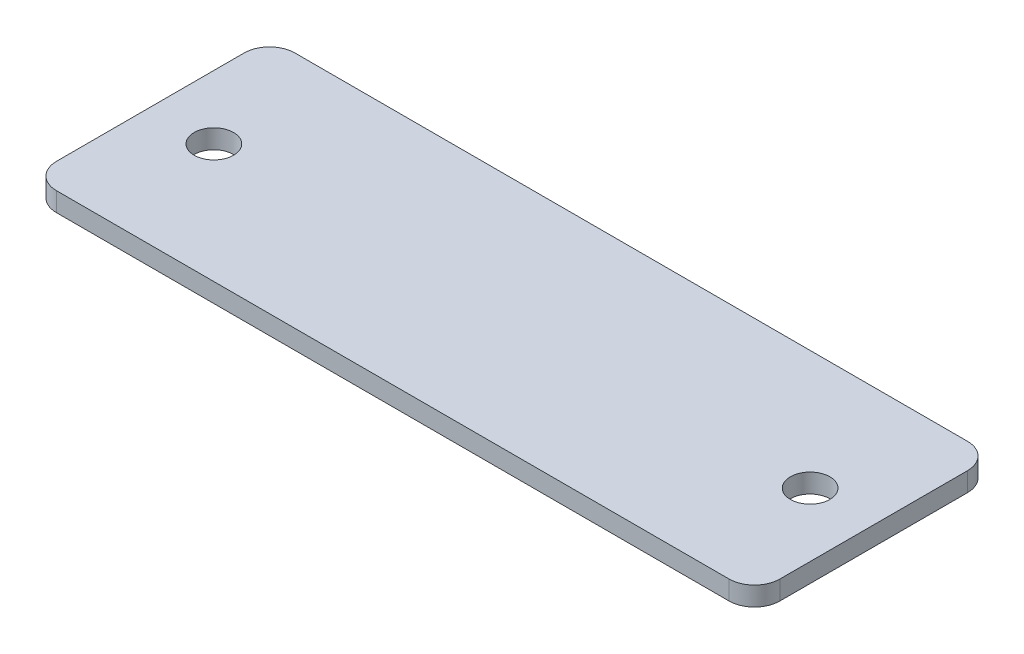
ISO-10303-21;
HEADER;
FILE_DESCRIPTION(('STEP AP214'),'2;1');
FILE_NAME('part.step','',(''),(''),'','','');
FILE_SCHEMA(('AUTOMOTIVE_DESIGN { 1 0 10303 214 1 1 1 1 }'));
ENDSEC;
DATA;
#1=APPLICATION_CONTEXT('core data for automotive mechanical design processes');
#2=APPLICATION_PROTOCOL_DEFINITION('international standard','automotive_design',2000,#1);
#3=PRODUCT_CONTEXT('',#1,'mechanical');
#4=PRODUCT('Part','Part','',(#3));
#5=PRODUCT_RELATED_PRODUCT_CATEGORY('part','',(#4));
#6=PRODUCT_DEFINITION_FORMATION('','',#4);
#7=PRODUCT_DEFINITION_CONTEXT('part definition',#1,'design');
#8=PRODUCT_DEFINITION('design','',#6,#7);
#9=PRODUCT_DEFINITION_SHAPE('','',#8);
#10=(LENGTH_UNIT() NAMED_UNIT(*) SI_UNIT(.MILLI.,.METRE.));
#11=(NAMED_UNIT(*) PLANE_ANGLE_UNIT() SI_UNIT($,.RADIAN.));
#12=(NAMED_UNIT(*) SI_UNIT($,.STERADIAN.) SOLID_ANGLE_UNIT());
#13=UNCERTAINTY_MEASURE_WITH_UNIT(LENGTH_MEASURE(1.E-05),#10,'distance_accuracy_value','');
#14=(GEOMETRIC_REPRESENTATION_CONTEXT(3) GLOBAL_UNCERTAINTY_ASSIGNED_CONTEXT((#13)) GLOBAL_UNIT_ASSIGNED_CONTEXT((#10,
#11,#12)) REPRESENTATION_CONTEXT('',''));
#15=CARTESIAN_POINT('',(0.,0.,0.));
#16=DIRECTION('',(0.,0.,1.));
#17=DIRECTION('',(1.,0.,0.));
#18=AXIS2_PLACEMENT_3D('',#15,#16,#17);
#19=CARTESIAN_POINT('',(28.4375,1.5,9.375));
#20=DIRECTION('',(-1.,0.,0.));
#21=DIRECTION('',(0.,0.,1.));
#22=AXIS2_PLACEMENT_3D('',#19,#20,#21);
#23=PLANE('',#22);
#24=DIRECTION('',(0.,0.,-1.));
#25=VECTOR('',#24,1.);
#26=CARTESIAN_POINT('',(28.4375,0.,9.375));
#27=LINE('',#26,#25);
#28=CARTESIAN_POINT('',(28.4375,0.,7.375));
#29=VERTEX_POINT('',#28);
#30=CARTESIAN_POINT('',(28.4375,0.,-7.375));
#31=VERTEX_POINT('',#30);
#32=EDGE_CURVE('E145',#29,#31,#27,.T.);
#33=ORIENTED_EDGE('',*,*,#32,.T.);
#34=DIRECTION('',(0.,-1.,0.));
#35=VECTOR('',#34,1.);
#36=CARTESIAN_POINT('',(28.4375,1.5,-7.375));
#37=LINE('',#36,#35);
#38=CARTESIAN_POINT('',(28.4375,1.5,-7.375));
#39=VERTEX_POINT('',#38);
#40=EDGE_CURVE('E11',#31,#39,#37,.F.);
#41=ORIENTED_EDGE('',*,*,#40,.T.);
#42=DIRECTION('',(0.,0.,-1.));
#43=VECTOR('',#42,1.);
#44=CARTESIAN_POINT('',(28.4375,1.5,9.375));
#45=LINE('',#44,#43);
#46=CARTESIAN_POINT('',(28.4375,1.5,7.375));
#47=VERTEX_POINT('',#46);
#48=EDGE_CURVE('E143',#47,#39,#45,.T.);
#49=ORIENTED_EDGE('',*,*,#48,.F.);
#50=DIRECTION('',(0.,-1.,0.));
#51=VECTOR('',#50,1.);
#52=CARTESIAN_POINT('',(28.4375,1.5,7.375));
#53=LINE('',#52,#51);
#54=EDGE_CURVE('E52',#47,#29,#53,.T.);
#55=ORIENTED_EDGE('',*,*,#54,.T.);
#56=EDGE_LOOP('',(#33,#41,#49,#55));
#57=FACE_BOUND('',#56,.T.);
#58=ADVANCED_FACE('F43',(#57),#23,.F.);
#59=CARTESIAN_POINT('',(-28.4375,1.5,-9.375));
#60=DIRECTION('',(0.,0.,1.));
#61=DIRECTION('',(1.,0.,0.));
#62=AXIS2_PLACEMENT_3D('',#59,#60,#61);
#63=PLANE('',#62);
#64=DIRECTION('',(-1.,0.,0.));
#65=VECTOR('',#64,1.);
#66=CARTESIAN_POINT('',(-28.4375,0.,-9.375));
#67=LINE('',#66,#65);
#68=CARTESIAN_POINT('',(26.4375,0.,-9.375));
#69=VERTEX_POINT('',#68);
#70=CARTESIAN_POINT('',(-26.4375,0.,-9.375));
#71=VERTEX_POINT('',#70);
#72=EDGE_CURVE('E139',#69,#71,#67,.T.);
#73=ORIENTED_EDGE('',*,*,#72,.T.);
#74=DIRECTION('',(0.,-1.,0.));
#75=VECTOR('',#74,1.);
#76=CARTESIAN_POINT('',(-26.4375,1.5,-9.375));
#77=LINE('',#76,#75);
#78=CARTESIAN_POINT('',(-26.4375,1.5,-9.375));
#79=VERTEX_POINT('',#78);
#80=EDGE_CURVE('E115',#71,#79,#77,.F.);
#81=ORIENTED_EDGE('',*,*,#80,.T.);
#82=DIRECTION('',(-1.,0.,0.));
#83=VECTOR('',#82,1.);
#84=CARTESIAN_POINT('',(-28.4375,1.5,-9.375));
#85=LINE('',#84,#83);
#86=CARTESIAN_POINT('',(26.4375,1.5,-9.375));
#87=VERTEX_POINT('',#86);
#88=EDGE_CURVE('E202',#87,#79,#85,.T.);
#89=ORIENTED_EDGE('',*,*,#88,.F.);
#90=DIRECTION('',(0.,-1.,0.));
#91=VECTOR('',#90,1.);
#92=CARTESIAN_POINT('',(26.4375,1.5,-9.375));
#93=LINE('',#92,#91);
#94=EDGE_CURVE('E121',#87,#69,#93,.T.);
#95=ORIENTED_EDGE('',*,*,#94,.T.);
#96=EDGE_LOOP('',(#73,#81,#89,#95));
#97=FACE_BOUND('',#96,.T.);
#98=ADVANCED_FACE('F232',(#97),#63,.F.);
#99=CARTESIAN_POINT('',(-28.4375,1.5,9.375));
#100=DIRECTION('',(1.,0.,0.));
#101=DIRECTION('',(0.,0.,-1.));
#102=AXIS2_PLACEMENT_3D('',#99,#100,#101);
#103=PLANE('',#102);
#104=DIRECTION('',(0.,0.,1.));
#105=VECTOR('',#104,1.);
#106=CARTESIAN_POINT('',(-28.4375,1.5,9.375));
#107=LINE('',#106,#105);
#108=CARTESIAN_POINT('',(-28.4375,1.5,-7.375));
#109=VERTEX_POINT('',#108);
#110=CARTESIAN_POINT('',(-28.4375,1.5,7.375));
#111=VERTEX_POINT('',#110);
#112=EDGE_CURVE('E130',#109,#111,#107,.T.);
#113=ORIENTED_EDGE('',*,*,#112,.F.);
#114=DIRECTION('',(0.,-1.,0.));
#115=VECTOR('',#114,1.);
#116=CARTESIAN_POINT('',(-28.4375,1.5,-7.375));
#117=LINE('',#116,#115);
#118=CARTESIAN_POINT('',(-28.4375,0.,-7.375));
#119=VERTEX_POINT('',#118);
#120=EDGE_CURVE('E114',#109,#119,#117,.T.);
#121=ORIENTED_EDGE('',*,*,#120,.T.);
#122=DIRECTION('',(0.,0.,1.));
#123=VECTOR('',#122,1.);
#124=CARTESIAN_POINT('',(-28.4375,0.,9.375));
#125=LINE('',#124,#123);
#126=CARTESIAN_POINT('',(-28.4375,0.,7.375));
#127=VERTEX_POINT('',#126);
#128=EDGE_CURVE('E128',#119,#127,#125,.T.);
#129=ORIENTED_EDGE('',*,*,#128,.T.);
#130=DIRECTION('',(0.,-1.,0.));
#131=VECTOR('',#130,1.);
#132=CARTESIAN_POINT('',(-28.4375,1.5,7.375));
#133=LINE('',#132,#131);
#134=EDGE_CURVE('E133',#127,#111,#133,.F.);
#135=ORIENTED_EDGE('',*,*,#134,.T.);
#136=EDGE_LOOP('',(#113,#121,#129,#135));
#137=FACE_BOUND('',#136,.T.);
#138=ADVANCED_FACE('F127',(#137),#103,.F.);
#139=CARTESIAN_POINT('',(-28.4375,1.5,9.375));
#140=DIRECTION('',(0.,0.,-1.));
#141=DIRECTION('',(-1.,0.,0.));
#142=AXIS2_PLACEMENT_3D('',#139,#140,#141);
#143=PLANE('',#142);
#144=DIRECTION('',(1.,0.,0.));
#145=VECTOR('',#144,1.);
#146=CARTESIAN_POINT('',(-28.4375,1.5,9.375));
#147=LINE('',#146,#145);
#148=CARTESIAN_POINT('',(-26.4375,1.5,9.375));
#149=VERTEX_POINT('',#148);
#150=CARTESIAN_POINT('',(26.4375,1.5,9.375));
#151=VERTEX_POINT('',#150);
#152=EDGE_CURVE('E150',#149,#151,#147,.T.);
#153=ORIENTED_EDGE('',*,*,#152,.F.);
#154=DIRECTION('',(0.,-1.,0.));
#155=VECTOR('',#154,1.);
#156=CARTESIAN_POINT('',(-26.4375,1.5,9.375));
#157=LINE('',#156,#155);
#158=CARTESIAN_POINT('',(-26.4375,0.,9.375));
#159=VERTEX_POINT('',#158);
#160=EDGE_CURVE('E177',#149,#159,#157,.T.);
#161=ORIENTED_EDGE('',*,*,#160,.T.);
#162=DIRECTION('',(1.,0.,0.));
#163=VECTOR('',#162,1.);
#164=CARTESIAN_POINT('',(-28.4375,0.,9.375));
#165=LINE('',#164,#163);
#166=CARTESIAN_POINT('',(26.4375,0.,9.375));
#167=VERTEX_POINT('',#166);
#168=EDGE_CURVE('E138',#159,#167,#165,.T.);
#169=ORIENTED_EDGE('',*,*,#168,.T.);
#170=DIRECTION('',(0.,-1.,0.));
#171=VECTOR('',#170,1.);
#172=CARTESIAN_POINT('',(26.4375,1.5,9.375));
#173=LINE('',#172,#171);
#174=EDGE_CURVE('E59',#167,#151,#173,.F.);
#175=ORIENTED_EDGE('',*,*,#174,.T.);
#176=EDGE_LOOP('',(#153,#161,#169,#175));
#177=FACE_BOUND('',#176,.T.);
#178=ADVANCED_FACE('F225',(#177),#143,.F.);
#179=CARTESIAN_POINT('',(0.,1.5,0.));
#180=DIRECTION('',(0.,-1.,0.));
#181=DIRECTION('',(0.,0.,-1.));
#182=AXIS2_PLACEMENT_3D('',#179,#180,#181);
#183=PLANE('',#182);
#184=CARTESIAN_POINT('',(-23.4375,1.5,0.));
#185=DIRECTION('',(0.,1.,0.));
#186=DIRECTION('',(0.,0.,1.));
#187=AXIS2_PLACEMENT_3D('',#184,#185,#186);
#188=CIRCLE('',#187,1.55);
#189=CARTESIAN_POINT('',(-23.4375,1.5,1.55000000000001));
#190=VERTEX_POINT('',#189);
#191=EDGE_CURVE('E195',#190,#190,#188,.T.);
#192=ORIENTED_EDGE('',*,*,#191,.F.);
#193=EDGE_LOOP('',(#192));
#194=FACE_BOUND('',#193,.T.);
#195=CARTESIAN_POINT('',(23.4375,1.5,0.));
#196=DIRECTION('',(0.,1.,0.));
#197=DIRECTION('',(0.,0.,1.));
#198=AXIS2_PLACEMENT_3D('',#195,#196,#197);
#199=CIRCLE('',#198,1.55);
#200=CARTESIAN_POINT('',(23.4375,1.5,1.55));
#201=VERTEX_POINT('',#200);
#202=EDGE_CURVE('E212',#201,#201,#199,.T.);
#203=ORIENTED_EDGE('',*,*,#202,.F.);
#204=EDGE_LOOP('',(#203));
#205=FACE_BOUND('',#204,.T.);
#206=ORIENTED_EDGE('',*,*,#88,.T.);
#207=CARTESIAN_POINT('',(-26.4375,1.5,-7.375));
#208=DIRECTION('',(0.,-1.,0.));
#209=DIRECTION('',(0.,0.,-1.));
#210=AXIS2_PLACEMENT_3D('',#207,#208,#209);
#211=CIRCLE('',#210,2.);
#212=EDGE_CURVE('E172',#79,#109,#211,.F.);
#213=ORIENTED_EDGE('',*,*,#212,.T.);
#214=ORIENTED_EDGE('',*,*,#112,.T.);
#215=CARTESIAN_POINT('',(-26.4375,1.5,7.375));
#216=DIRECTION('',(0.,-1.,0.));
#217=DIRECTION('',(0.,0.,-1.));
#218=AXIS2_PLACEMENT_3D('',#215,#216,#217);
#219=CIRCLE('',#218,2.);
#220=EDGE_CURVE('E66',#111,#149,#219,.F.);
#221=ORIENTED_EDGE('',*,*,#220,.T.);
#222=ORIENTED_EDGE('',*,*,#152,.T.);
#223=CARTESIAN_POINT('',(26.4375,1.5,7.375));
#224=DIRECTION('',(0.,-1.,0.));
#225=DIRECTION('',(0.,0.,-1.));
#226=AXIS2_PLACEMENT_3D('',#223,#224,#225);
#227=CIRCLE('',#226,2.);
#228=EDGE_CURVE('E164',#151,#47,#227,.F.);
#229=ORIENTED_EDGE('',*,*,#228,.T.);
#230=ORIENTED_EDGE('',*,*,#48,.T.);
#231=CARTESIAN_POINT('',(26.4375,1.5,-7.375));
#232=DIRECTION('',(0.,-1.,0.));
#233=DIRECTION('',(0.,0.,-1.));
#234=AXIS2_PLACEMENT_3D('',#231,#232,#233);
#235=CIRCLE('',#234,2.);
#236=EDGE_CURVE('E167',#39,#87,#235,.F.);
#237=ORIENTED_EDGE('',*,*,#236,.T.);
#238=EDGE_LOOP('',(#206,#213,#214,#221,#222,#229,#230,#237));
#239=FACE_BOUND('',#238,.T.);
#240=ADVANCED_FACE('F222',(#194,#205,#239),#183,.F.);
#241=CARTESIAN_POINT('',(0.,0.,0.));
#242=DIRECTION('',(0.,-1.,0.));
#243=DIRECTION('',(0.,0.,-1.));
#244=AXIS2_PLACEMENT_3D('',#241,#242,#243);
#245=PLANE('',#244);
#246=CARTESIAN_POINT('',(-23.4375,0.,0.));
#247=DIRECTION('',(0.,1.,0.));
#248=DIRECTION('',(0.,0.,1.));
#249=AXIS2_PLACEMENT_3D('',#246,#247,#248);
#250=CIRCLE('',#249,1.55);
#251=CARTESIAN_POINT('',(-23.4375,0.,1.55000000000001));
#252=VERTEX_POINT('',#251);
#253=EDGE_CURVE('E192',#252,#252,#250,.T.);
#254=ORIENTED_EDGE('',*,*,#253,.T.);
#255=EDGE_LOOP('',(#254));
#256=FACE_BOUND('',#255,.T.);
#257=CARTESIAN_POINT('',(23.4375,0.,0.));
#258=DIRECTION('',(0.,1.,0.));
#259=DIRECTION('',(0.,0.,1.));
#260=AXIS2_PLACEMENT_3D('',#257,#258,#259);
#261=CIRCLE('',#260,1.55);
#262=CARTESIAN_POINT('',(23.4375,0.,1.55));
#263=VERTEX_POINT('',#262);
#264=EDGE_CURVE('E208',#263,#263,#261,.T.);
#265=ORIENTED_EDGE('',*,*,#264,.T.);
#266=EDGE_LOOP('',(#265));
#267=FACE_BOUND('',#266,.T.);
#268=ORIENTED_EDGE('',*,*,#128,.F.);
#269=CARTESIAN_POINT('',(-26.4375,0.,-7.375));
#270=DIRECTION('',(0.,-1.,0.));
#271=DIRECTION('',(0.,0.,-1.));
#272=AXIS2_PLACEMENT_3D('',#269,#270,#271);
#273=CIRCLE('',#272,2.);
#274=EDGE_CURVE('E110',#119,#71,#273,.T.);
#275=ORIENTED_EDGE('',*,*,#274,.T.);
#276=ORIENTED_EDGE('',*,*,#72,.F.);
#277=CARTESIAN_POINT('',(26.4375,0.,-7.375));
#278=DIRECTION('',(0.,-1.,0.));
#279=DIRECTION('',(0.,0.,-1.));
#280=AXIS2_PLACEMENT_3D('',#277,#278,#279);
#281=CIRCLE('',#280,2.);
#282=EDGE_CURVE('E154',#69,#31,#281,.T.);
#283=ORIENTED_EDGE('',*,*,#282,.T.);
#284=ORIENTED_EDGE('',*,*,#32,.F.);
#285=CARTESIAN_POINT('',(26.4375,0.,7.375));
#286=DIRECTION('',(0.,-1.,0.));
#287=DIRECTION('',(0.,0.,-1.));
#288=AXIS2_PLACEMENT_3D('',#285,#286,#287);
#289=CIRCLE('',#288,2.);
#290=EDGE_CURVE('E132',#29,#167,#289,.T.);
#291=ORIENTED_EDGE('',*,*,#290,.T.);
#292=ORIENTED_EDGE('',*,*,#168,.F.);
#293=CARTESIAN_POINT('',(-26.4375,0.,7.375));
#294=DIRECTION('',(0.,-1.,0.));
#295=DIRECTION('',(0.,0.,-1.));
#296=AXIS2_PLACEMENT_3D('',#293,#294,#295);
#297=CIRCLE('',#296,2.);
#298=EDGE_CURVE('E122',#159,#127,#297,.T.);
#299=ORIENTED_EDGE('',*,*,#298,.T.);
#300=EDGE_LOOP('',(#268,#275,#276,#283,#284,#291,#292,#299));
#301=FACE_BOUND('',#300,.T.);
#302=ADVANCED_FACE('F135',(#256,#267,#301),#245,.T.);
#303=CARTESIAN_POINT('',(-26.4375,1.5,-7.375));
#304=DIRECTION('',(0.,-1.,0.));
#305=DIRECTION('',(0.,0.,-1.));
#306=AXIS2_PLACEMENT_3D('',#303,#304,#305);
#307=CYLINDRICAL_SURFACE('',#306,2.);
#308=ORIENTED_EDGE('',*,*,#212,.F.);
#309=ORIENTED_EDGE('',*,*,#80,.F.);
#310=ORIENTED_EDGE('',*,*,#274,.F.);
#311=ORIENTED_EDGE('',*,*,#120,.F.);
#312=EDGE_LOOP('',(#308,#309,#310,#311));
#313=FACE_BOUND('',#312,.T.);
#314=ADVANCED_FACE('F113',(#313),#307,.T.);
#315=CARTESIAN_POINT('',(-26.4375,1.5,7.375));
#316=DIRECTION('',(0.,-1.,0.));
#317=DIRECTION('',(0.,0.,-1.));
#318=AXIS2_PLACEMENT_3D('',#315,#316,#317);
#319=CYLINDRICAL_SURFACE('',#318,2.);
#320=ORIENTED_EDGE('',*,*,#220,.F.);
#321=ORIENTED_EDGE('',*,*,#134,.F.);
#322=ORIENTED_EDGE('',*,*,#298,.F.);
#323=ORIENTED_EDGE('',*,*,#160,.F.);
#324=EDGE_LOOP('',(#320,#321,#322,#323));
#325=FACE_BOUND('',#324,.T.);
#326=ADVANCED_FACE('F243',(#325),#319,.T.);
#327=CARTESIAN_POINT('',(26.4375,1.5,-7.375));
#328=DIRECTION('',(0.,-1.,0.));
#329=DIRECTION('',(0.,0.,-1.));
#330=AXIS2_PLACEMENT_3D('',#327,#328,#329);
#331=CYLINDRICAL_SURFACE('',#330,2.);
#332=ORIENTED_EDGE('',*,*,#236,.F.);
#333=ORIENTED_EDGE('',*,*,#40,.F.);
#334=ORIENTED_EDGE('',*,*,#282,.F.);
#335=ORIENTED_EDGE('',*,*,#94,.F.);
#336=EDGE_LOOP('',(#332,#333,#334,#335));
#337=FACE_BOUND('',#336,.T.);
#338=ADVANCED_FACE('F234',(#337),#331,.T.);
#339=CARTESIAN_POINT('',(26.4375,1.5,7.375));
#340=DIRECTION('',(0.,-1.,0.));
#341=DIRECTION('',(0.,0.,-1.));
#342=AXIS2_PLACEMENT_3D('',#339,#340,#341);
#343=CYLINDRICAL_SURFACE('',#342,2.);
#344=ORIENTED_EDGE('',*,*,#228,.F.);
#345=ORIENTED_EDGE('',*,*,#174,.F.);
#346=ORIENTED_EDGE('',*,*,#290,.F.);
#347=ORIENTED_EDGE('',*,*,#54,.F.);
#348=EDGE_LOOP('',(#344,#345,#346,#347));
#349=FACE_BOUND('',#348,.T.);
#350=ADVANCED_FACE('F45',(#349),#343,.T.);
#351=CARTESIAN_POINT('',(23.4375,0.,0.));
#352=DIRECTION('',(0.,1.,0.));
#353=DIRECTION('',(0.,0.,1.));
#354=AXIS2_PLACEMENT_3D('',#351,#352,#353);
#355=CYLINDRICAL_SURFACE('',#354,1.55);
#356=ORIENTED_EDGE('',*,*,#264,.F.);
#357=EDGE_LOOP('',(#356));
#358=FACE_BOUND('',#357,.T.);
#359=ORIENTED_EDGE('',*,*,#202,.T.);
#360=EDGE_LOOP('',(#359));
#361=FACE_BOUND('',#360,.T.);
#362=ADVANCED_FACE('F236',(#358,#361),#355,.F.);
#363=CARTESIAN_POINT('',(-23.4375,0.,0.));
#364=DIRECTION('',(0.,1.,0.));
#365=DIRECTION('',(0.,0.,1.));
#366=AXIS2_PLACEMENT_3D('',#363,#364,#365);
#367=CYLINDRICAL_SURFACE('',#366,1.55);
#368=ORIENTED_EDGE('',*,*,#253,.F.);
#369=EDGE_LOOP('',(#368));
#370=FACE_BOUND('',#369,.T.);
#371=ORIENTED_EDGE('',*,*,#191,.T.);
#372=EDGE_LOOP('',(#371));
#373=FACE_BOUND('',#372,.T.);
#374=ADVANCED_FACE('F220',(#370,#373),#367,.F.);
#375=CLOSED_SHELL('',(#58,#98,#138,#178,#240,#302,#314,#326,#338,#350,#362,#374));
#376=MANIFOLD_SOLID_BREP('B2',#375);
#377=ADVANCED_BREP_SHAPE_REPRESENTATION('',(#18,#376),#14);
#378=SHAPE_DEFINITION_REPRESENTATION(#9,#377);
ENDSEC;
END-ISO-10303-21;
